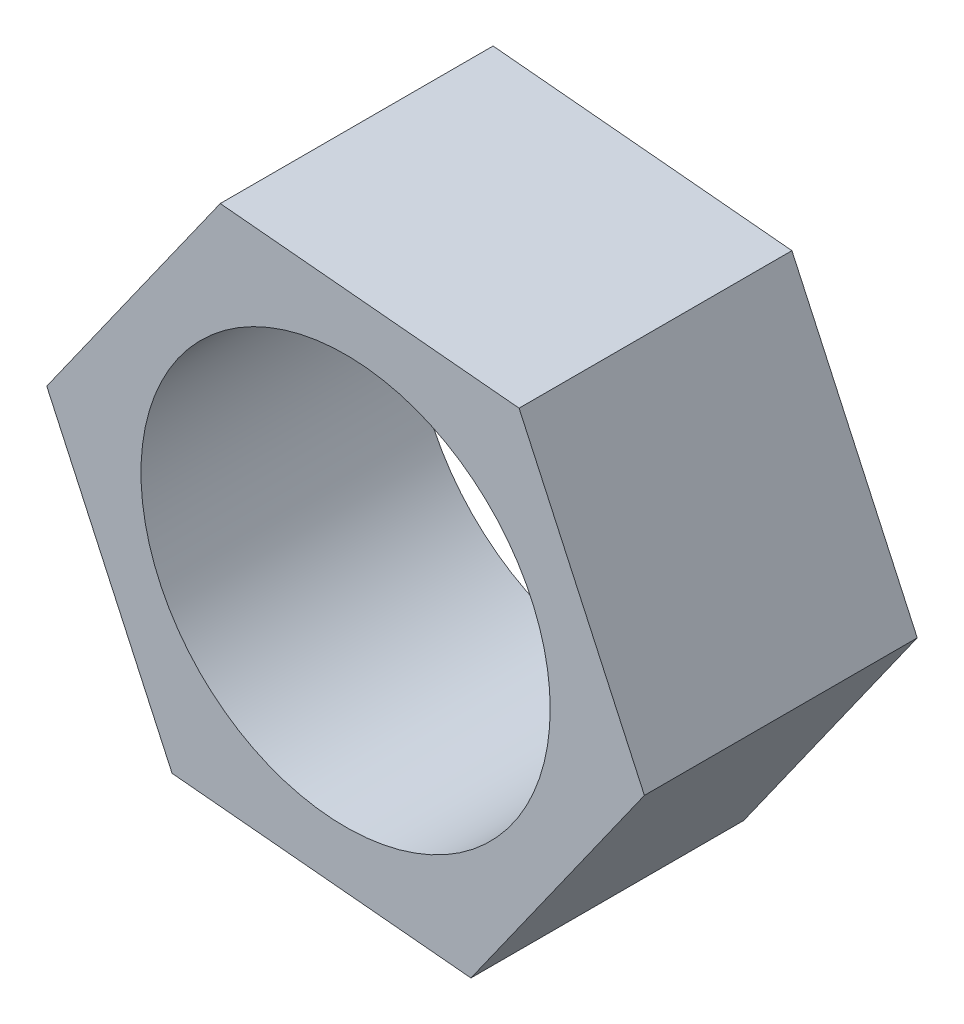
ISO-10303-21;
HEADER;
FILE_DESCRIPTION(('STEP AP214'),'2;1');
FILE_NAME('part.step','',(''),(''),'','','');
FILE_SCHEMA(('AUTOMOTIVE_DESIGN { 1 0 10303 214 1 1 1 1 }'));
ENDSEC;
DATA;
#1=APPLICATION_CONTEXT('core data for automotive mechanical design processes');
#2=APPLICATION_PROTOCOL_DEFINITION('international standard','automotive_design',2000,#1);
#3=PRODUCT_CONTEXT('',#1,'mechanical');
#4=PRODUCT('Part','Part','',(#3));
#5=PRODUCT_RELATED_PRODUCT_CATEGORY('part','',(#4));
#6=PRODUCT_DEFINITION_FORMATION('','',#4);
#7=PRODUCT_DEFINITION_CONTEXT('part definition',#1,'design');
#8=PRODUCT_DEFINITION('design','',#6,#7);
#9=PRODUCT_DEFINITION_SHAPE('','',#8);
#10=(LENGTH_UNIT() NAMED_UNIT(*) SI_UNIT(.MILLI.,.METRE.));
#11=(NAMED_UNIT(*) PLANE_ANGLE_UNIT() SI_UNIT($,.RADIAN.));
#12=(NAMED_UNIT(*) SI_UNIT($,.STERADIAN.) SOLID_ANGLE_UNIT());
#13=UNCERTAINTY_MEASURE_WITH_UNIT(LENGTH_MEASURE(1.E-05),#10,'distance_accuracy_value','');
#14=(GEOMETRIC_REPRESENTATION_CONTEXT(3) GLOBAL_UNCERTAINTY_ASSIGNED_CONTEXT((#13)) GLOBAL_UNIT_ASSIGNED_CONTEXT((#10,
#11,#12)) REPRESENTATION_CONTEXT('',''));
#15=CARTESIAN_POINT('',(0.,0.,0.));
#16=DIRECTION('',(0.,0.,1.));
#17=DIRECTION('',(1.,0.,0.));
#18=AXIS2_PLACEMENT_3D('',#15,#16,#17);
#19=CARTESIAN_POINT('',(0.,0.,10.));
#20=DIRECTION('',(0.,0.,1.));
#21=DIRECTION('',(1.,0.,0.));
#22=AXIS2_PLACEMENT_3D('',#19,#20,#21);
#23=PLANE('',#22);
#24=DIRECTION('',(-0.41760576747389,0.908628319486325,0.));
#25=VECTOR('',#24,1.);
#26=CARTESIAN_POINT('',(10.9526790011107,-1.01922651978264,10.));
#27=LINE('',#26,#25);
#28=CARTESIAN_POINT('',(10.9526790011107,-1.01922651978264,10.));
#29=VERTEX_POINT('',#28);
#30=CARTESIAN_POINT('',(6.35901555889794,8.97568499456693,10.));
#31=VERTEX_POINT('',#30);
#32=EDGE_CURVE('E129',#29,#31,#27,.T.);
#33=ORIENTED_EDGE('',*,*,#32,.T.);
#34=DIRECTION('',(-0.995698091010066,0.0926569563438766,0.));
#35=VECTOR('',#34,1.);
#36=CARTESIAN_POINT('',(6.35901555889794,8.97568499456693,10.));
#37=LINE('',#36,#35);
#38=CARTESIAN_POINT('',(-4.59366344221278,9.99491151434957,10.));
#39=VERTEX_POINT('',#38);
#40=EDGE_CURVE('E87',#31,#39,#37,.T.);
#41=ORIENTED_EDGE('',*,*,#40,.T.);
#42=DIRECTION('',(-0.578092323536175,-0.815971363142449,0.));
#43=VECTOR('',#42,1.);
#44=CARTESIAN_POINT('',(-4.59366344221278,9.99491151434957,10.));
#45=LINE('',#44,#43);
#46=CARTESIAN_POINT('',(-10.9526790011107,1.01922651978263,10.));
#47=VERTEX_POINT('',#46);
#48=EDGE_CURVE('E100',#39,#47,#45,.T.);
#49=ORIENTED_EDGE('',*,*,#48,.T.);
#50=DIRECTION('',(0.41760576747389,-0.908628319486325,0.));
#51=VECTOR('',#50,1.);
#52=CARTESIAN_POINT('',(-10.9526790011107,1.01922651978263,10.));
#53=LINE('',#52,#51);
#54=CARTESIAN_POINT('',(-6.35901555889793,-8.97568499456694,10.));
#55=VERTEX_POINT('',#54);
#56=EDGE_CURVE('E94',#47,#55,#53,.T.);
#57=ORIENTED_EDGE('',*,*,#56,.T.);
#58=DIRECTION('',(0.995698091010066,-0.0926569563438763,0.));
#59=VECTOR('',#58,1.);
#60=CARTESIAN_POINT('',(-6.35901555889793,-8.97568499456694,10.));
#61=LINE('',#60,#59);
#62=CARTESIAN_POINT('',(4.59366344221279,-9.99491151434958,10.));
#63=VERTEX_POINT('',#62);
#64=EDGE_CURVE('E98',#55,#63,#61,.T.);
#65=ORIENTED_EDGE('',*,*,#64,.T.);
#66=DIRECTION('',(0.578092323536176,0.815971363142448,0.));
#67=VECTOR('',#66,1.);
#68=CARTESIAN_POINT('',(4.59366344221279,-9.99491151434958,10.));
#69=LINE('',#68,#67);
#70=EDGE_CURVE('E50',#63,#29,#69,.T.);
#71=ORIENTED_EDGE('',*,*,#70,.T.);
#72=EDGE_LOOP('',(#33,#41,#49,#57,#65,#71));
#73=FACE_BOUND('',#72,.T.);
#74=CARTESIAN_POINT('',(0.,0.,10.));
#75=DIRECTION('',(0.,0.,1.));
#76=DIRECTION('',(1.,0.,0.));
#77=AXIS2_PLACEMENT_3D('',#74,#75,#76);
#78=CIRCLE('',#77,7.5);
#79=CARTESIAN_POINT('',(7.5,0.,10.));
#80=VERTEX_POINT('',#79);
#81=EDGE_CURVE('E122',#80,#80,#78,.T.);
#82=ORIENTED_EDGE('',*,*,#81,.F.);
#83=EDGE_LOOP('',(#82));
#84=FACE_BOUND('',#83,.T.);
#85=ADVANCED_FACE('F33',(#73,#84),#23,.T.);
#86=CARTESIAN_POINT('',(0.,0.,0.));
#87=DIRECTION('',(0.,0.,1.));
#88=DIRECTION('',(1.,0.,0.));
#89=AXIS2_PLACEMENT_3D('',#86,#87,#88);
#90=PLANE('',#89);
#91=DIRECTION('',(-0.41760576747389,0.908628319486325,0.));
#92=VECTOR('',#91,1.);
#93=CARTESIAN_POINT('',(10.9526790011107,-1.01922651978264,0.));
#94=LINE('',#93,#92);
#95=CARTESIAN_POINT('',(10.9526790011107,-1.01922651978264,0.));
#96=VERTEX_POINT('',#95);
#97=CARTESIAN_POINT('',(6.35901555889794,8.97568499456693,0.));
#98=VERTEX_POINT('',#97);
#99=EDGE_CURVE('E118',#96,#98,#94,.T.);
#100=ORIENTED_EDGE('',*,*,#99,.F.);
#101=DIRECTION('',(0.578092323536176,0.815971363142448,0.));
#102=VECTOR('',#101,1.);
#103=CARTESIAN_POINT('',(4.59366344221279,-9.99491151434958,0.));
#104=LINE('',#103,#102);
#105=CARTESIAN_POINT('',(4.59366344221279,-9.99491151434958,0.));
#106=VERTEX_POINT('',#105);
#107=EDGE_CURVE('E79',#106,#96,#104,.T.);
#108=ORIENTED_EDGE('',*,*,#107,.F.);
#109=DIRECTION('',(0.995698091010066,-0.0926569563438763,0.));
#110=VECTOR('',#109,1.);
#111=CARTESIAN_POINT('',(-6.35901555889793,-8.97568499456694,0.));
#112=LINE('',#111,#110);
#113=CARTESIAN_POINT('',(-6.35901555889793,-8.97568499456694,0.));
#114=VERTEX_POINT('',#113);
#115=EDGE_CURVE('E73',#114,#106,#112,.T.);
#116=ORIENTED_EDGE('',*,*,#115,.F.);
#117=DIRECTION('',(0.41760576747389,-0.908628319486325,0.));
#118=VECTOR('',#117,1.);
#119=CARTESIAN_POINT('',(-10.9526790011107,1.01922651978263,0.));
#120=LINE('',#119,#118);
#121=CARTESIAN_POINT('',(-10.9526790011107,1.01922651978263,0.));
#122=VERTEX_POINT('',#121);
#123=EDGE_CURVE('E108',#122,#114,#120,.T.);
#124=ORIENTED_EDGE('',*,*,#123,.F.);
#125=DIRECTION('',(-0.578092323536175,-0.815971363142449,0.));
#126=VECTOR('',#125,1.);
#127=CARTESIAN_POINT('',(-4.59366344221278,9.99491151434957,0.));
#128=LINE('',#127,#126);
#129=CARTESIAN_POINT('',(-4.59366344221278,9.99491151434957,0.));
#130=VERTEX_POINT('',#129);
#131=EDGE_CURVE('E124',#130,#122,#128,.T.);
#132=ORIENTED_EDGE('',*,*,#131,.F.);
#133=DIRECTION('',(-0.995698091010066,0.0926569563438766,0.));
#134=VECTOR('',#133,1.);
#135=CARTESIAN_POINT('',(6.35901555889794,8.97568499456693,0.));
#136=LINE('',#135,#134);
#137=EDGE_CURVE('E121',#98,#130,#136,.T.);
#138=ORIENTED_EDGE('',*,*,#137,.F.);
#139=EDGE_LOOP('',(#100,#108,#116,#124,#132,#138));
#140=FACE_BOUND('',#139,.T.);
#141=CARTESIAN_POINT('',(0.,0.,0.));
#142=DIRECTION('',(0.,0.,1.));
#143=DIRECTION('',(1.,0.,0.));
#144=AXIS2_PLACEMENT_3D('',#141,#142,#143);
#145=CIRCLE('',#144,7.5);
#146=CARTESIAN_POINT('',(7.5,0.,0.));
#147=VERTEX_POINT('',#146);
#148=EDGE_CURVE('E222',#147,#147,#145,.T.);
#149=ORIENTED_EDGE('',*,*,#148,.T.);
#150=EDGE_LOOP('',(#149));
#151=FACE_BOUND('',#150,.T.);
#152=ADVANCED_FACE('F138',(#140,#151),#90,.F.);
#153=CARTESIAN_POINT('',(10.9526790011107,-1.01922651978264,10.));
#154=DIRECTION('',(-0.908628319486325,-0.41760576747389,0.));
#155=DIRECTION('',(0.41760576747389,-0.908628319486325,0.));
#156=AXIS2_PLACEMENT_3D('',#153,#154,#155);
#157=PLANE('',#156);
#158=ORIENTED_EDGE('',*,*,#99,.T.);
#159=DIRECTION('',(0.,0.,-1.));
#160=VECTOR('',#159,1.);
#161=CARTESIAN_POINT('',(6.35901555889794,8.97568499456693,10.));
#162=LINE('',#161,#160);
#163=EDGE_CURVE('E11',#31,#98,#162,.T.);
#164=ORIENTED_EDGE('',*,*,#163,.F.);
#165=ORIENTED_EDGE('',*,*,#32,.F.);
#166=DIRECTION('',(0.,0.,-1.));
#167=VECTOR('',#166,1.);
#168=CARTESIAN_POINT('',(10.9526790011107,-1.01922651978264,10.));
#169=LINE('',#168,#167);
#170=EDGE_CURVE('E114',#29,#96,#169,.T.);
#171=ORIENTED_EDGE('',*,*,#170,.T.);
#172=EDGE_LOOP('',(#158,#164,#165,#171));
#173=FACE_BOUND('',#172,.T.);
#174=ADVANCED_FACE('F35',(#173),#157,.F.);
#175=CARTESIAN_POINT('',(6.35901555889794,8.97568499456693,10.));
#176=DIRECTION('',(-0.0926569563438766,-0.995698091010066,0.));
#177=DIRECTION('',(0.995698091010066,-0.0926569563438766,0.));
#178=AXIS2_PLACEMENT_3D('',#175,#176,#177);
#179=PLANE('',#178);
#180=ORIENTED_EDGE('',*,*,#137,.T.);
#181=DIRECTION('',(0.,0.,-1.));
#182=VECTOR('',#181,1.);
#183=CARTESIAN_POINT('',(-4.59366344221278,9.99491151434957,10.));
#184=LINE('',#183,#182);
#185=EDGE_CURVE('E42',#39,#130,#184,.T.);
#186=ORIENTED_EDGE('',*,*,#185,.F.);
#187=ORIENTED_EDGE('',*,*,#40,.F.);
#188=ORIENTED_EDGE('',*,*,#163,.T.);
#189=EDGE_LOOP('',(#180,#186,#187,#188));
#190=FACE_BOUND('',#189,.T.);
#191=ADVANCED_FACE('F163',(#190),#179,.F.);
#192=CARTESIAN_POINT('',(-4.59366344221278,9.99491151434957,10.));
#193=DIRECTION('',(0.815971363142449,-0.578092323536175,0.));
#194=DIRECTION('',(0.578092323536175,0.815971363142449,0.));
#195=AXIS2_PLACEMENT_3D('',#192,#193,#194);
#196=PLANE('',#195);
#197=ORIENTED_EDGE('',*,*,#131,.T.);
#198=DIRECTION('',(0.,0.,-1.));
#199=VECTOR('',#198,1.);
#200=CARTESIAN_POINT('',(-10.9526790011107,1.01922651978263,10.));
#201=LINE('',#200,#199);
#202=EDGE_CURVE('E109',#47,#122,#201,.T.);
#203=ORIENTED_EDGE('',*,*,#202,.F.);
#204=ORIENTED_EDGE('',*,*,#48,.F.);
#205=ORIENTED_EDGE('',*,*,#185,.T.);
#206=EDGE_LOOP('',(#197,#203,#204,#205));
#207=FACE_BOUND('',#206,.T.);
#208=ADVANCED_FACE('F135',(#207),#196,.F.);
#209=CARTESIAN_POINT('',(-10.9526790011107,1.01922651978263,10.));
#210=DIRECTION('',(0.908628319486325,0.41760576747389,0.));
#211=DIRECTION('',(-0.41760576747389,0.908628319486325,0.));
#212=AXIS2_PLACEMENT_3D('',#209,#210,#211);
#213=PLANE('',#212);
#214=ORIENTED_EDGE('',*,*,#123,.T.);
#215=DIRECTION('',(0.,0.,-1.));
#216=VECTOR('',#215,1.);
#217=CARTESIAN_POINT('',(-6.35901555889793,-8.97568499456694,10.));
#218=LINE('',#217,#216);
#219=EDGE_CURVE('E105',#55,#114,#218,.T.);
#220=ORIENTED_EDGE('',*,*,#219,.F.);
#221=ORIENTED_EDGE('',*,*,#56,.F.);
#222=ORIENTED_EDGE('',*,*,#202,.T.);
#223=EDGE_LOOP('',(#214,#220,#221,#222));
#224=FACE_BOUND('',#223,.T.);
#225=ADVANCED_FACE('F106',(#224),#213,.F.);
#226=CARTESIAN_POINT('',(-6.35901555889793,-8.97568499456694,10.));
#227=DIRECTION('',(0.0926569563438763,0.995698091010066,0.));
#228=DIRECTION('',(-0.995698091010066,0.0926569563438763,0.));
#229=AXIS2_PLACEMENT_3D('',#226,#227,#228);
#230=PLANE('',#229);
#231=ORIENTED_EDGE('',*,*,#115,.T.);
#232=DIRECTION('',(0.,0.,-1.));
#233=VECTOR('',#232,1.);
#234=CARTESIAN_POINT('',(4.59366344221279,-9.99491151434958,10.));
#235=LINE('',#234,#233);
#236=EDGE_CURVE('E110',#63,#106,#235,.T.);
#237=ORIENTED_EDGE('',*,*,#236,.F.);
#238=ORIENTED_EDGE('',*,*,#64,.F.);
#239=ORIENTED_EDGE('',*,*,#219,.T.);
#240=EDGE_LOOP('',(#231,#237,#238,#239));
#241=FACE_BOUND('',#240,.T.);
#242=ADVANCED_FACE('F112',(#241),#230,.F.);
#243=CARTESIAN_POINT('',(4.59366344221279,-9.99491151434958,10.));
#244=DIRECTION('',(-0.815971363142448,0.578092323536176,0.));
#245=DIRECTION('',(-0.578092323536176,-0.815971363142449,0.));
#246=AXIS2_PLACEMENT_3D('',#243,#244,#245);
#247=PLANE('',#246);
#248=ORIENTED_EDGE('',*,*,#107,.T.);
#249=ORIENTED_EDGE('',*,*,#170,.F.);
#250=ORIENTED_EDGE('',*,*,#70,.F.);
#251=ORIENTED_EDGE('',*,*,#236,.T.);
#252=EDGE_LOOP('',(#248,#249,#250,#251));
#253=FACE_BOUND('',#252,.T.);
#254=ADVANCED_FACE('F143',(#253),#247,.F.);
#255=CARTESIAN_POINT('',(0.,0.,10.));
#256=DIRECTION('',(0.,0.,-1.));
#257=DIRECTION('',(-1.,0.,0.));
#258=AXIS2_PLACEMENT_3D('',#255,#256,#257);
#259=CYLINDRICAL_SURFACE('',#258,7.5);
#260=ORIENTED_EDGE('',*,*,#81,.T.);
#261=EDGE_LOOP('',(#260));
#262=FACE_BOUND('',#261,.T.);
#263=ORIENTED_EDGE('',*,*,#148,.F.);
#264=EDGE_LOOP('',(#263));
#265=FACE_BOUND('',#264,.T.);
#266=ADVANCED_FACE('F145',(#262,#265),#259,.F.);
#267=CLOSED_SHELL('',(#85,#152,#174,#191,#208,#225,#242,#254,#266));
#268=MANIFOLD_SOLID_BREP('B2',#267);
#269=ADVANCED_BREP_SHAPE_REPRESENTATION('',(#18,#268),#14);
#270=SHAPE_DEFINITION_REPRESENTATION(#9,#269);
ENDSEC;
END-ISO-10303-21;
